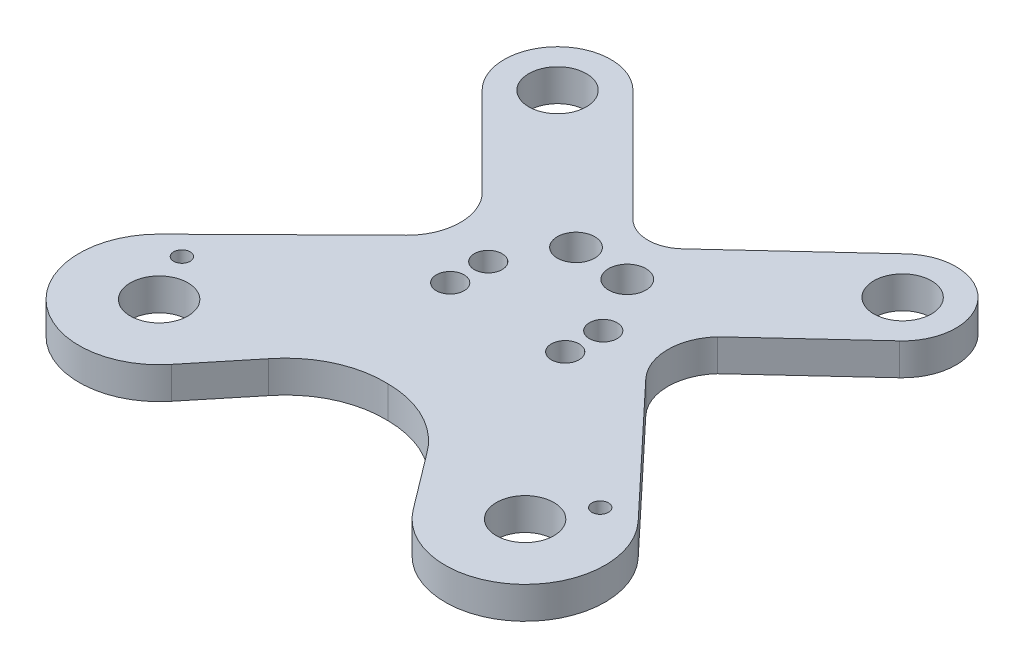
ISO-10303-21;
HEADER;
FILE_DESCRIPTION(('STEP AP214'),'2;1');
FILE_NAME('part.step','',(''),(''),'','','');
FILE_SCHEMA(('AUTOMOTIVE_DESIGN { 1 0 10303 214 1 1 1 1 }'));
ENDSEC;
DATA;
#1=APPLICATION_CONTEXT('core data for automotive mechanical design processes');
#2=APPLICATION_PROTOCOL_DEFINITION('international standard','automotive_design',2000,#1);
#3=PRODUCT_CONTEXT('',#1,'mechanical');
#4=PRODUCT('Part','Part','',(#3));
#5=PRODUCT_RELATED_PRODUCT_CATEGORY('part','',(#4));
#6=PRODUCT_DEFINITION_FORMATION('','',#4);
#7=PRODUCT_DEFINITION_CONTEXT('part definition',#1,'design');
#8=PRODUCT_DEFINITION('design','',#6,#7);
#9=PRODUCT_DEFINITION_SHAPE('','',#8);
#10=(LENGTH_UNIT() NAMED_UNIT(*) SI_UNIT(.MILLI.,.METRE.));
#11=(NAMED_UNIT(*) PLANE_ANGLE_UNIT() SI_UNIT($,.RADIAN.));
#12=(NAMED_UNIT(*) SI_UNIT($,.STERADIAN.) SOLID_ANGLE_UNIT());
#13=UNCERTAINTY_MEASURE_WITH_UNIT(LENGTH_MEASURE(1.E-05),#10,'distance_accuracy_value','');
#14=(GEOMETRIC_REPRESENTATION_CONTEXT(3) GLOBAL_UNCERTAINTY_ASSIGNED_CONTEXT((#13)) GLOBAL_UNIT_ASSIGNED_CONTEXT((#10,
#11,#12)) REPRESENTATION_CONTEXT('',''));
#15=CARTESIAN_POINT('',(0.,0.,0.));
#16=DIRECTION('',(0.,0.,1.));
#17=DIRECTION('',(1.,0.,0.));
#18=AXIS2_PLACEMENT_3D('',#15,#16,#17);
#19=CARTESIAN_POINT('',(-0.0956209056046931,6.00000000000001,-79.3848610675508));
#20=DIRECTION('',(0.,1.,0.));
#21=DIRECTION('',(0.707106781186548,0.,0.707106781186547));
#22=AXIS2_PLACEMENT_3D('',#19,#20,#21);
#23=PLANE('',#22);
#24=CARTESIAN_POINT('',(30.543589466593,6.00000000000001,-126.922027211166));
#25=DIRECTION('',(0.,1.,0.));
#26=DIRECTION('',(0.,0.,1.));
#27=AXIS2_PLACEMENT_3D('',#24,#25,#26);
#28=CIRCLE('',#27,3.50000000001008);
#29=CARTESIAN_POINT('',(30.543589466593,6.00000000000001,-123.422027211156));
#30=VERTEX_POINT('',#29);
#31=EDGE_CURVE('E379',#30,#30,#28,.T.);
#32=ORIENTED_EDGE('',*,*,#31,.F.);
#33=EDGE_LOOP('',(#32));
#34=FACE_BOUND('',#33,.T.);
#35=CARTESIAN_POINT('',(40.5360676139148,6.00000000000001,-126.534237996131));
#36=DIRECTION('',(0.,1.,0.));
#37=DIRECTION('',(0.,0.,1.));
#38=AXIS2_PLACEMENT_3D('',#35,#36,#37);
#39=CIRCLE('',#38,3.50000000001009);
#40=CARTESIAN_POINT('',(40.5360676139148,6.00000000000001,-123.034237996121));
#41=VERTEX_POINT('',#40);
#42=EDGE_CURVE('E389',#41,#41,#39,.T.);
#43=ORIENTED_EDGE('',*,*,#42,.F.);
#44=EDGE_LOOP('',(#43));
#45=FACE_BOUND('',#44,.T.);
#46=CARTESIAN_POINT('',(36.1184906391358,6.00000000000001,-141.638986628402));
#47=DIRECTION('',(0.,1.,0.));
#48=DIRECTION('',(0.,0.,1.));
#49=AXIS2_PLACEMENT_3D('',#46,#47,#48);
#50=CIRCLE('',#49,6.80088429812114);
#51=CARTESIAN_POINT('',(31.2171831110455,6.00000000000001,-136.924200127243));
#52=VERTEX_POINT('',#51);
#53=CARTESIAN_POINT('',(40.8332771402937,6.00000000000001,-136.73767910031));
#54=VERTEX_POINT('',#53);
#55=EDGE_CURVE('E297',#52,#54,#50,.T.);
#56=ORIENTED_EDGE('',*,*,#55,.F.);
#57=DIRECTION('',(-0.707106781186547,0.,-0.707106781186548));
#58=VECTOR('',#57,1.);
#59=CARTESIAN_POINT('',(31.2171831110543,6.00000000000001,-136.924200127251));
#60=LINE('',#59,#58);
#61=CARTESIAN_POINT('',(10.3593187347853,6.00000000000001,-157.78206450352));
#62=VERTEX_POINT('',#61);
#63=EDGE_CURVE('E292',#52,#62,#60,.T.);
#64=ORIENTED_EDGE('',*,*,#63,.T.);
#65=CARTESIAN_POINT('',(3.28825092291982,6.00000000000001,-150.710996691655));
#66=DIRECTION('',(0.,1.,0.));
#67=DIRECTION('',(0.707106781186548,0.,0.707106781186547));
#68=AXIS2_PLACEMENT_3D('',#65,#66,#67);
#69=CIRCLE('',#68,9.99999999999999);
#70=CARTESIAN_POINT('',(-3.78281688894563,6.00000000000001,-143.639928879789));
#71=VERTEX_POINT('',#70);
#72=EDGE_CURVE('E163',#62,#71,#69,.T.);
#73=ORIENTED_EDGE('',*,*,#72,.T.);
#74=DIRECTION('',(0.707106781186547,0.,0.707106781186548));
#75=VECTOR('',#74,1.);
#76=CARTESIAN_POINT('',(-3.78281688894563,6.00000000000003,-143.639928879789));
#77=LINE('',#76,#75);
#78=CARTESIAN_POINT('',(13.3364073304925,6.00000000000002,-126.520704660351));
#79=VERTEX_POINT('',#78);
#80=EDGE_CURVE('E156',#71,#79,#77,.T.);
#81=ORIENTED_EDGE('',*,*,#80,.T.);
#82=CARTESIAN_POINT('',(5.6549620242041,6.00000000000002,-120.11793978832));
#83=DIRECTION('',(0.,-1.,0.));
#84=DIRECTION('',(0.707106781186548,0.,0.707106781186547));
#85=AXIS2_PLACEMENT_3D('',#82,#83,#84);
#86=CIRCLE('',#85,10.0000000000005);
#87=CARTESIAN_POINT('',(12.6692660736421,6.00000000000002,-112.990560276743));
#88=VERTEX_POINT('',#87);
#89=EDGE_CURVE('E161',#79,#88,#86,.T.);
#90=ORIENTED_EDGE('',*,*,#89,.T.);
#91=DIRECTION('',(-0.712737951157667,0.,0.701430404943763));
#92=VECTOR('',#91,1.);
#93=CARTESIAN_POINT('',(-10.7731885851043,6.00000000000001,-89.9200188001007));
#94=LINE('',#93,#92);
#95=CARTESIAN_POINT('',(-10.7731885851043,6.00000000000001,-89.9200188001007));
#96=VERTEX_POINT('',#95);
#97=EDGE_CURVE('E51',#88,#96,#94,.T.);
#98=ORIENTED_EDGE('',*,*,#97,.T.);
#99=CARTESIAN_POINT('',(-0.0956209056046931,6.00000000000001,-79.3848610675508));
#100=DIRECTION('',(0.,1.,0.));
#101=DIRECTION('',(0.707106781186548,0.,0.707106781186547));
#102=AXIS2_PLACEMENT_3D('',#99,#100,#101);
#103=CIRCLE('',#102,15.);
#104=CARTESIAN_POINT('',(11.5870667076271,6.00000000000001,-69.9766300897506));
#105=VERTEX_POINT('',#104);
#106=EDGE_CURVE('E213',#96,#105,#103,.T.);
#107=ORIENTED_EDGE('',*,*,#106,.T.);
#108=DIRECTION('',(0.632796065046581,0.,-0.774318500399908));
#109=VECTOR('',#108,1.);
#110=CARTESIAN_POINT('',(19.7924089135706,6.00000000000002,-80.0170659001511));
#111=LINE('',#110,#109);
#112=CARTESIAN_POINT('',(19.7924089135706,6.00000000000002,-80.0170659001511));
#113=VERTEX_POINT('',#112);
#114=EDGE_CURVE('E119',#105,#113,#111,.T.);
#115=ORIENTED_EDGE('',*,*,#114,.T.);
#116=CARTESIAN_POINT('',(34.407869350894,6.00000000000001,-68.6150192080081));
#117=DIRECTION('',(0.,-1.,0.));
#118=DIRECTION('',(0.707106781186548,0.,0.707106781186547));
#119=AXIS2_PLACEMENT_3D('',#116,#117,#118);
#120=CIRCLE('',#119,18.5369456104498);
#121=CARTESIAN_POINT('',(35.0613956637842,6.00000000000001,-87.1404410904683));
#122=VERTEX_POINT('',#121);
#123=EDGE_CURVE('E255',#113,#122,#120,.T.);
#124=ORIENTED_EDGE('',*,*,#123,.T.);
#125=CARTESIAN_POINT('',(34.9960345228104,6.00000000000001,-68.6036107118404));
#126=DIRECTION('',(0.,-1.,0.));
#127=DIRECTION('',(-0.707106781186548,0.,-0.707106781186547));
#128=AXIS2_PLACEMENT_3D('',#125,#126,#127);
#129=CIRCLE('',#128,18.5369456104498);
#130=CARTESIAN_POINT('',(50.0426604997642,6.00000000000001,-79.4303091594019));
#131=VERTEX_POINT('',#130);
#132=EDGE_CURVE('E275',#122,#131,#129,.T.);
#133=ORIENTED_EDGE('',*,*,#132,.T.);
#134=DIRECTION('',(0.602292848823194,0.,0.798275218365472));
#135=VECTOR('',#134,1.);
#136=CARTESIAN_POINT('',(50.0426604997643,6.00000000000001,-79.4303091594019));
#137=LINE('',#136,#135);
#138=CARTESIAN_POINT('',(57.8524734960304,6.00000000000001,-69.0792312955869));
#139=VERTEX_POINT('',#138);
#140=EDGE_CURVE('E272',#131,#139,#137,.T.);
#141=ORIENTED_EDGE('',*,*,#140,.T.);
#142=CARTESIAN_POINT('',(69.891214614326,6.00000000000002,-78.0273435147458));
#143=DIRECTION('',(0.,1.,0.));
#144=DIRECTION('',(-0.707106781186548,0.,-0.707106781186547));
#145=AXIS2_PLACEMENT_3D('',#142,#143,#144);
#146=CIRCLE('',#145,15.);
#147=CARTESIAN_POINT('',(80.9692928394584,6.00000000000002,-88.1405122979633));
#148=VERTEX_POINT('',#147);
#149=EDGE_CURVE('E274',#139,#148,#146,.T.);
#150=ORIENTED_EDGE('',*,*,#149,.T.);
#151=DIRECTION('',(-0.6850011255575,0.,-0.728542008387271));
#152=VECTOR('',#151,1.);
#153=CARTESIAN_POINT('',(80.9692928394584,6.00000000000002,-88.1405122979633));
#154=LINE('',#153,#152);
#155=CARTESIAN_POINT('',(58.4391219667141,6.00000000000001,-112.102773562248));
#156=VERTEX_POINT('',#155);
#157=EDGE_CURVE('E277',#148,#156,#154,.T.);
#158=ORIENTED_EDGE('',*,*,#157,.T.);
#159=CARTESIAN_POINT('',(65.7245420505871,6.00000000000001,-118.952784817823));
#160=DIRECTION('',(0.,-1.,0.));
#161=DIRECTION('',(-0.707106781186548,0.,-0.707106781186547));
#162=AXIS2_PLACEMENT_3D('',#159,#160,#161);
#163=CIRCLE('',#162,10.0000000000005);
#164=CARTESIAN_POINT('',(58.2971669306716,6.00000000000001,-125.648611789009));
#165=VERTEX_POINT('',#164);
#166=EDGE_CURVE('E283',#156,#165,#163,.T.);
#167=ORIENTED_EDGE('',*,*,#166,.T.);
#168=DIRECTION('',(0.733995744245187,0.,-0.679154067520731));
#169=VECTOR('',#168,1.);
#170=CARTESIAN_POINT('',(76.0673793740617,6.00000000000002,-142.091094127987));
#171=LINE('',#170,#169);
#172=CARTESIAN_POINT('',(76.0673793740617,6.00000000000002,-142.091094127987));
#173=VERTEX_POINT('',#172);
#174=EDGE_CURVE('E285',#165,#173,#171,.T.);
#175=ORIENTED_EDGE('',*,*,#174,.T.);
#176=CARTESIAN_POINT('',(69.2758386988545,6.00000000000002,-149.431051570439));
#177=DIRECTION('',(0.,1.,0.));
#178=DIRECTION('',(-0.707106781186548,0.,-0.707106781186547));
#179=AXIS2_PLACEMENT_3D('',#176,#177,#178);
#180=CIRCLE('',#179,10.);
#181=CARTESIAN_POINT('',(62.4842980236472,6.00000000000001,-156.77100901289));
#182=VERTEX_POINT('',#181);
#183=EDGE_CURVE('E287',#173,#182,#180,.T.);
#184=ORIENTED_EDGE('',*,*,#183,.T.);
#185=DIRECTION('',(-0.733995744245188,0.,0.679154067520731));
#186=VECTOR('',#185,1.);
#187=CARTESIAN_POINT('',(40.8332771403023,6.00000000000001,-136.737679100302));
#188=LINE('',#187,#186);
#189=EDGE_CURVE('E289',#182,#54,#188,.T.);
#190=ORIENTED_EDGE('',*,*,#189,.T.);
#191=EDGE_LOOP('',(#56,#64,#73,#81,#90,#98,#107,#115,#124,#133,#141,#150,#158,#167,#175,#184,#190));
#192=FACE_BOUND('',#191,.T.);
#193=CARTESIAN_POINT('',(-4.92014261445839,6.00000000000003,-88.4801340304254));
#194=DIRECTION('',(0.,-1.,0.));
#195=DIRECTION('',(0.,0.,-1.));
#196=AXIS2_PLACEMENT_3D('',#193,#194,#195);
#197=CIRCLE('',#196,1.54999999946635);
#198=CARTESIAN_POINT('',(-4.92014261445839,6.00000000000003,-90.0301340298918));
#199=VERTEX_POINT('',#198);
#200=EDGE_CURVE('E397',#199,#199,#197,.T.);
#201=ORIENTED_EDGE('',*,*,#200,.T.);
#202=EDGE_LOOP('',(#201));
#203=FACE_BOUND('',#202,.T.);
#204=CARTESIAN_POINT('',(75.0648122654624,6.00000000000003,-86.9286853986485));
#205=DIRECTION('',(0.,-1.,0.));
#206=DIRECTION('',(0.,0.,-1.));
#207=AXIS2_PLACEMENT_3D('',#204,#205,#206);
#208=CIRCLE('',#207,1.54999999946642);
#209=CARTESIAN_POINT('',(75.0648122654624,6.00000000000003,-88.4786853981149));
#210=VERTEX_POINT('',#209);
#211=EDGE_CURVE('E403',#210,#210,#208,.T.);
#212=ORIENTED_EDGE('',*,*,#211,.T.);
#213=EDGE_LOOP('',(#212));
#214=FACE_BOUND('',#213,.T.);
#215=CARTESIAN_POINT('',(46.4864782501451,6.00000000000002,-108.948907371714));
#216=DIRECTION('',(0.,1.,0.));
#217=DIRECTION('',(0.,0.,1.));
#218=AXIS2_PLACEMENT_3D('',#215,#216,#217);
#219=CIRCLE('',#218,2.59999999999984);
#220=CARTESIAN_POINT('',(46.4864782501451,6.00000000000002,-106.348907371714));
#221=VERTEX_POINT('',#220);
#222=EDGE_CURVE('E415',#221,#221,#219,.T.);
#223=ORIENTED_EDGE('',*,*,#222,.F.);
#224=EDGE_LOOP('',(#223));
#225=FACE_BOUND('',#224,.T.);
#226=CARTESIAN_POINT('',(24.4906156581669,6.00000000000002,-109.375555745452));
#227=DIRECTION('',(0.,1.,0.));
#228=DIRECTION('',(0.,0.,1.));
#229=AXIS2_PLACEMENT_3D('',#226,#227,#228);
#230=CIRCLE('',#229,2.59999999999989);
#231=CARTESIAN_POINT('',(24.4906156581669,6.00000000000002,-106.775555745453));
#232=VERTEX_POINT('',#231);
#233=EDGE_CURVE('E427',#232,#232,#230,.T.);
#234=ORIENTED_EDGE('',*,*,#233,.F.);
#235=EDGE_LOOP('',(#234));
#236=FACE_BOUND('',#235,.T.);
#237=CARTESIAN_POINT('',(3.28825092291982,6.00000000000001,-150.710996691655));
#238=DIRECTION('',(0.,1.,0.));
#239=DIRECTION('',(0.707106781186548,0.,0.707106781186547));
#240=AXIS2_PLACEMENT_3D('',#237,#238,#239);
#241=CIRCLE('',#240,5.4);
#242=CARTESIAN_POINT('',(7.10662754132717,6.00000000000001,-146.892620073247));
#243=VERTEX_POINT('',#242);
#244=EDGE_CURVE('E439',#243,#243,#241,.T.);
#245=ORIENTED_EDGE('',*,*,#244,.F.);
#246=EDGE_LOOP('',(#245));
#247=FACE_BOUND('',#246,.T.);
#248=CARTESIAN_POINT('',(-0.0956209056046931,6.00000000000001,-79.3848610675508));
#249=DIRECTION('',(0.,1.,0.));
#250=DIRECTION('',(0.707106781186548,0.,0.707106781186547));
#251=AXIS2_PLACEMENT_3D('',#248,#249,#250);
#252=CIRCLE('',#251,5.40000000000001);
#253=CARTESIAN_POINT('',(3.72275571280267,6.00000000000001,-75.5664844491434));
#254=VERTEX_POINT('',#253);
#255=EDGE_CURVE('E185',#254,#254,#252,.T.);
#256=ORIENTED_EDGE('',*,*,#255,.F.);
#257=EDGE_LOOP('',(#256));
#258=FACE_BOUND('',#257,.T.);
#259=CARTESIAN_POINT('',(69.891214614326,6.00000000000002,-78.0273435147458));
#260=DIRECTION('',(0.,1.,0.));
#261=DIRECTION('',(-0.707106781186548,0.,-0.707106781186547));
#262=AXIS2_PLACEMENT_3D('',#259,#260,#261);
#263=CIRCLE('',#262,5.40000000000001);
#264=CARTESIAN_POINT('',(66.0728379959186,6.00000000000002,-81.8457201331531));
#265=VERTEX_POINT('',#264);
#266=EDGE_CURVE('E445',#265,#265,#263,.T.);
#267=ORIENTED_EDGE('',*,*,#266,.F.);
#268=EDGE_LOOP('',(#267));
#269=FACE_BOUND('',#268,.T.);
#270=CARTESIAN_POINT('',(69.2758386988545,6.00000000000002,-149.431051570439));
#271=DIRECTION('',(0.,1.,0.));
#272=DIRECTION('',(-0.707106781186548,0.,-0.707106781186547));
#273=AXIS2_PLACEMENT_3D('',#270,#271,#272);
#274=CIRCLE('',#273,5.4);
#275=CARTESIAN_POINT('',(65.4574620804471,6.00000000000002,-153.249428188846));
#276=VERTEX_POINT('',#275);
#277=EDGE_CURVE('E433',#276,#276,#274,.T.);
#278=ORIENTED_EDGE('',*,*,#277,.F.);
#279=EDGE_LOOP('',(#278));
#280=FACE_BOUND('',#279,.T.);
#281=CARTESIAN_POINT('',(24.6263674134474,6.00000000000002,-116.374239297446));
#282=DIRECTION('',(0.,1.,0.));
#283=DIRECTION('',(0.,0.,1.));
#284=AXIS2_PLACEMENT_3D('',#281,#282,#283);
#285=CIRCLE('',#284,2.59999999999994);
#286=CARTESIAN_POINT('',(24.6263674134474,6.00000000000002,-113.774239297446));
#287=VERTEX_POINT('',#286);
#288=EDGE_CURVE('E421',#287,#287,#285,.T.);
#289=ORIENTED_EDGE('',*,*,#288,.F.);
#290=EDGE_LOOP('',(#289));
#291=FACE_BOUND('',#290,.T.);
#292=CARTESIAN_POINT('',(46.6222300054256,6.00000000000002,-115.947590923707));
#293=DIRECTION('',(0.,1.,0.));
#294=DIRECTION('',(0.,0.,1.));
#295=AXIS2_PLACEMENT_3D('',#292,#293,#294);
#296=CIRCLE('',#295,2.59999999999991);
#297=CARTESIAN_POINT('',(46.6222300054256,6.00000000000002,-113.347590923707));
#298=VERTEX_POINT('',#297);
#299=EDGE_CURVE('E409',#298,#298,#296,.T.);
#300=ORIENTED_EDGE('',*,*,#299,.F.);
#301=EDGE_LOOP('',(#300));
#302=FACE_BOUND('',#301,.T.);
#303=ADVANCED_FACE('F34',(#34,#45,#192,#203,#214,#225,#236,#247,#258,#269,#280,#291,#302),#23,.T.);
#304=CARTESIAN_POINT('',(-0.0956209056046931,0.,-79.3848610675508));
#305=DIRECTION('',(0.,1.,0.));
#306=DIRECTION('',(0.707106781186548,0.,0.707106781186547));
#307=AXIS2_PLACEMENT_3D('',#304,#305,#306);
#308=PLANE('',#307);
#309=CARTESIAN_POINT('',(30.543589466593,0.,-126.922027211166));
#310=DIRECTION('',(0.,-1.,0.));
#311=DIRECTION('',(0.,0.,-1.));
#312=AXIS2_PLACEMENT_3D('',#309,#310,#311);
#313=CIRCLE('',#312,3.50000000001008);
#314=CARTESIAN_POINT('',(30.543589466593,0.,-130.422027211176));
#315=VERTEX_POINT('',#314);
#316=EDGE_CURVE('E382',#315,#315,#313,.T.);
#317=ORIENTED_EDGE('',*,*,#316,.F.);
#318=EDGE_LOOP('',(#317));
#319=FACE_BOUND('',#318,.T.);
#320=CARTESIAN_POINT('',(40.5360676139148,0.,-126.534237996131));
#321=DIRECTION('',(0.,-1.,0.));
#322=DIRECTION('',(0.,0.,-1.));
#323=AXIS2_PLACEMENT_3D('',#320,#321,#322);
#324=CIRCLE('',#323,3.50000000001009);
#325=CARTESIAN_POINT('',(40.5360676139148,0.,-130.034237996141));
#326=VERTEX_POINT('',#325);
#327=EDGE_CURVE('E384',#326,#326,#324,.T.);
#328=ORIENTED_EDGE('',*,*,#327,.F.);
#329=EDGE_LOOP('',(#328));
#330=FACE_BOUND('',#329,.T.);
#331=CARTESIAN_POINT('',(-4.92014261445839,0.,-88.4801340304254));
#332=DIRECTION('',(0.,-1.,0.));
#333=DIRECTION('',(0.,0.,-1.));
#334=AXIS2_PLACEMENT_3D('',#331,#332,#333);
#335=CIRCLE('',#334,1.54999999946635);
#336=CARTESIAN_POINT('',(-4.92014261445839,0.,-90.0301340298918));
#337=VERTEX_POINT('',#336);
#338=EDGE_CURVE('E395',#337,#337,#335,.T.);
#339=ORIENTED_EDGE('',*,*,#338,.F.);
#340=EDGE_LOOP('',(#339));
#341=FACE_BOUND('',#340,.T.);
#342=CARTESIAN_POINT('',(75.0648122654624,0.,-86.9286853986485));
#343=DIRECTION('',(0.,-1.,0.));
#344=DIRECTION('',(0.,0.,-1.));
#345=AXIS2_PLACEMENT_3D('',#342,#343,#344);
#346=CIRCLE('',#345,1.54999999946642);
#347=CARTESIAN_POINT('',(75.0648122654624,0.,-88.4786853981149));
#348=VERTEX_POINT('',#347);
#349=EDGE_CURVE('E400',#348,#348,#346,.T.);
#350=ORIENTED_EDGE('',*,*,#349,.F.);
#351=EDGE_LOOP('',(#350));
#352=FACE_BOUND('',#351,.T.);
#353=CARTESIAN_POINT('',(46.4864782501451,0.,-108.948907371714));
#354=DIRECTION('',(0.,1.,0.));
#355=DIRECTION('',(0.,0.,1.));
#356=AXIS2_PLACEMENT_3D('',#353,#354,#355);
#357=CIRCLE('',#356,2.59999999999984);
#358=CARTESIAN_POINT('',(46.4864782501451,0.,-106.348907371714));
#359=VERTEX_POINT('',#358);
#360=EDGE_CURVE('E412',#359,#359,#357,.T.);
#361=ORIENTED_EDGE('',*,*,#360,.T.);
#362=EDGE_LOOP('',(#361));
#363=FACE_BOUND('',#362,.T.);
#364=CARTESIAN_POINT('',(24.4906156581669,0.,-109.375555745452));
#365=DIRECTION('',(0.,1.,0.));
#366=DIRECTION('',(0.,0.,1.));
#367=AXIS2_PLACEMENT_3D('',#364,#365,#366);
#368=CIRCLE('',#367,2.59999999999989);
#369=CARTESIAN_POINT('',(24.4906156581669,0.,-106.775555745453));
#370=VERTEX_POINT('',#369);
#371=EDGE_CURVE('E424',#370,#370,#368,.T.);
#372=ORIENTED_EDGE('',*,*,#371,.T.);
#373=EDGE_LOOP('',(#372));
#374=FACE_BOUND('',#373,.T.);
#375=CARTESIAN_POINT('',(3.28825092291982,0.,-150.710996691655));
#376=DIRECTION('',(0.,1.,0.));
#377=DIRECTION('',(0.707106781186548,0.,0.707106781186547));
#378=AXIS2_PLACEMENT_3D('',#375,#376,#377);
#379=CIRCLE('',#378,5.4);
#380=CARTESIAN_POINT('',(7.10662754132717,0.,-146.892620073247));
#381=VERTEX_POINT('',#380);
#382=EDGE_CURVE('E436',#381,#381,#379,.T.);
#383=ORIENTED_EDGE('',*,*,#382,.T.);
#384=EDGE_LOOP('',(#383));
#385=FACE_BOUND('',#384,.T.);
#386=CARTESIAN_POINT('',(-0.0956209056046931,0.,-79.3848610675508));
#387=DIRECTION('',(0.,1.,0.));
#388=DIRECTION('',(0.707106781186548,0.,0.707106781186547));
#389=AXIS2_PLACEMENT_3D('',#386,#387,#388);
#390=CIRCLE('',#389,5.40000000000001);
#391=CARTESIAN_POINT('',(3.72275571280267,0.,-75.5664844491434));
#392=VERTEX_POINT('',#391);
#393=EDGE_CURVE('E448',#392,#392,#390,.T.);
#394=ORIENTED_EDGE('',*,*,#393,.T.);
#395=EDGE_LOOP('',(#394));
#396=FACE_BOUND('',#395,.T.);
#397=DIRECTION('',(-0.707106781186547,0.,-0.707106781186548));
#398=VECTOR('',#397,1.);
#399=CARTESIAN_POINT('',(31.2171831110543,0.,-136.924200127251));
#400=LINE('',#399,#398);
#401=CARTESIAN_POINT('',(31.2171831110543,0.,-136.924200127251));
#402=VERTEX_POINT('',#401);
#403=CARTESIAN_POINT('',(10.3593187347853,0.,-157.78206450352));
#404=VERTEX_POINT('',#403);
#405=EDGE_CURVE('E206',#402,#404,#400,.T.);
#406=ORIENTED_EDGE('',*,*,#405,.F.);
#407=CARTESIAN_POINT('',(36.1184906391358,0.,-141.638986628402));
#408=DIRECTION('',(0.,1.,0.));
#409=DIRECTION('',(0.,0.,1.));
#410=AXIS2_PLACEMENT_3D('',#407,#408,#409);
#411=CIRCLE('',#410,6.80088429812114);
#412=CARTESIAN_POINT('',(40.8332771402937,0.,-136.73767910031));
#413=VERTEX_POINT('',#412);
#414=EDGE_CURVE('E392',#402,#413,#411,.T.);
#415=ORIENTED_EDGE('',*,*,#414,.T.);
#416=DIRECTION('',(-0.733995744245188,0.,0.679154067520731));
#417=VECTOR('',#416,1.);
#418=CARTESIAN_POINT('',(40.8332771403023,0.,-136.737679100302));
#419=LINE('',#418,#417);
#420=CARTESIAN_POINT('',(62.4842980236472,0.,-156.77100901289));
#421=VERTEX_POINT('',#420);
#422=EDGE_CURVE('E203',#421,#413,#419,.T.);
#423=ORIENTED_EDGE('',*,*,#422,.F.);
#424=CARTESIAN_POINT('',(69.2758386988545,0.,-149.431051570439));
#425=DIRECTION('',(0.,1.,0.));
#426=DIRECTION('',(-0.707106781186548,0.,-0.707106781186547));
#427=AXIS2_PLACEMENT_3D('',#424,#425,#426);
#428=CIRCLE('',#427,10.);
#429=CARTESIAN_POINT('',(76.0673793740617,0.,-142.091094127987));
#430=VERTEX_POINT('',#429);
#431=EDGE_CURVE('E201',#430,#421,#428,.T.);
#432=ORIENTED_EDGE('',*,*,#431,.F.);
#433=DIRECTION('',(0.733995744245187,0.,-0.679154067520731));
#434=VECTOR('',#433,1.);
#435=CARTESIAN_POINT('',(76.0673793740617,0.,-142.091094127987));
#436=LINE('',#435,#434);
#437=CARTESIAN_POINT('',(58.2971669306716,0.,-125.648611789009));
#438=VERTEX_POINT('',#437);
#439=EDGE_CURVE('E199',#438,#430,#436,.T.);
#440=ORIENTED_EDGE('',*,*,#439,.F.);
#441=CARTESIAN_POINT('',(65.7245420505871,0.,-118.952784817823));
#442=DIRECTION('',(0.,-1.,0.));
#443=DIRECTION('',(-0.707106781186548,0.,-0.707106781186547));
#444=AXIS2_PLACEMENT_3D('',#441,#442,#443);
#445=CIRCLE('',#444,10.0000000000005);
#446=CARTESIAN_POINT('',(58.4391219667141,0.,-112.102773562248));
#447=VERTEX_POINT('',#446);
#448=EDGE_CURVE('E197',#447,#438,#445,.T.);
#449=ORIENTED_EDGE('',*,*,#448,.F.);
#450=DIRECTION('',(-0.6850011255575,0.,-0.728542008387271));
#451=VECTOR('',#450,1.);
#452=CARTESIAN_POINT('',(80.9692928394584,0.,-88.1405122979633));
#453=LINE('',#452,#451);
#454=CARTESIAN_POINT('',(80.9692928394584,0.,-88.1405122979633));
#455=VERTEX_POINT('',#454);
#456=EDGE_CURVE('E195',#455,#447,#453,.T.);
#457=ORIENTED_EDGE('',*,*,#456,.F.);
#458=CARTESIAN_POINT('',(69.891214614326,0.,-78.0273435147458));
#459=DIRECTION('',(0.,1.,0.));
#460=DIRECTION('',(-0.707106781186548,0.,-0.707106781186547));
#461=AXIS2_PLACEMENT_3D('',#458,#459,#460);
#462=CIRCLE('',#461,15.);
#463=CARTESIAN_POINT('',(57.8524734960304,0.,-69.0792312955869));
#464=VERTEX_POINT('',#463);
#465=EDGE_CURVE('E193',#464,#455,#462,.T.);
#466=ORIENTED_EDGE('',*,*,#465,.F.);
#467=DIRECTION('',(0.602292848823194,0.,0.798275218365472));
#468=VECTOR('',#467,1.);
#469=CARTESIAN_POINT('',(50.0426604997643,0.,-79.4303091594019));
#470=LINE('',#469,#468);
#471=CARTESIAN_POINT('',(50.0426604997643,0.,-79.4303091594019));
#472=VERTEX_POINT('',#471);
#473=EDGE_CURVE('E191',#472,#464,#470,.T.);
#474=ORIENTED_EDGE('',*,*,#473,.F.);
#475=CARTESIAN_POINT('',(34.9960345228104,0.,-68.6036107118404));
#476=DIRECTION('',(0.,-1.,0.));
#477=DIRECTION('',(-0.707106781186548,0.,-0.707106781186547));
#478=AXIS2_PLACEMENT_3D('',#475,#476,#477);
#479=CIRCLE('',#478,18.5369456104498);
#480=CARTESIAN_POINT('',(35.0613956637842,0.,-87.1404410904683));
#481=VERTEX_POINT('',#480);
#482=EDGE_CURVE('E189',#481,#472,#479,.T.);
#483=ORIENTED_EDGE('',*,*,#482,.F.);
#484=CARTESIAN_POINT('',(34.407869350894,0.,-68.6150192080081));
#485=DIRECTION('',(0.,-1.,0.));
#486=DIRECTION('',(0.707106781186548,0.,0.707106781186547));
#487=AXIS2_PLACEMENT_3D('',#484,#485,#486);
#488=CIRCLE('',#487,18.5369456104498);
#489=CARTESIAN_POINT('',(19.7924089135706,0.,-80.0170659001511));
#490=VERTEX_POINT('',#489);
#491=EDGE_CURVE('E187',#490,#481,#488,.T.);
#492=ORIENTED_EDGE('',*,*,#491,.F.);
#493=DIRECTION('',(0.632796065046581,0.,-0.774318500399908));
#494=VECTOR('',#493,1.);
#495=CARTESIAN_POINT('',(19.7924089135706,0.,-80.0170659001511));
#496=LINE('',#495,#494);
#497=CARTESIAN_POINT('',(11.5870667076271,0.,-69.9766300897506));
#498=VERTEX_POINT('',#497);
#499=EDGE_CURVE('E184',#498,#490,#496,.T.);
#500=ORIENTED_EDGE('',*,*,#499,.F.);
#501=CARTESIAN_POINT('',(-0.0956209056046931,0.,-79.3848610675508));
#502=DIRECTION('',(0.,1.,0.));
#503=DIRECTION('',(0.707106781186548,0.,0.707106781186547));
#504=AXIS2_PLACEMENT_3D('',#501,#502,#503);
#505=CIRCLE('',#504,15.);
#506=CARTESIAN_POINT('',(-10.7731885851043,0.,-89.9200188001007));
#507=VERTEX_POINT('',#506);
#508=EDGE_CURVE('E181',#507,#498,#505,.T.);
#509=ORIENTED_EDGE('',*,*,#508,.F.);
#510=DIRECTION('',(-0.712737951157667,0.,0.701430404943763));
#511=VECTOR('',#510,1.);
#512=CARTESIAN_POINT('',(-10.7731885851043,0.,-89.9200188001007));
#513=LINE('',#512,#511);
#514=CARTESIAN_POINT('',(12.6692660736421,0.,-112.990560276743));
#515=VERTEX_POINT('',#514);
#516=EDGE_CURVE('E111',#515,#507,#513,.T.);
#517=ORIENTED_EDGE('',*,*,#516,.F.);
#518=CARTESIAN_POINT('',(5.6549620242041,0.,-120.11793978832));
#519=DIRECTION('',(0.,-1.,0.));
#520=DIRECTION('',(0.707106781186548,0.,0.707106781186547));
#521=AXIS2_PLACEMENT_3D('',#518,#519,#520);
#522=CIRCLE('',#521,10.0000000000005);
#523=CARTESIAN_POINT('',(13.3364073304925,0.,-126.520704660351));
#524=VERTEX_POINT('',#523);
#525=EDGE_CURVE('E105',#524,#515,#522,.T.);
#526=ORIENTED_EDGE('',*,*,#525,.F.);
#527=DIRECTION('',(0.707106781186547,0.,0.707106781186548));
#528=VECTOR('',#527,1.);
#529=CARTESIAN_POINT('',(-3.78281688894563,0.,-143.639928879789));
#530=LINE('',#529,#528);
#531=CARTESIAN_POINT('',(-3.78281688894563,0.,-143.639928879789));
#532=VERTEX_POINT('',#531);
#533=EDGE_CURVE('E171',#532,#524,#530,.T.);
#534=ORIENTED_EDGE('',*,*,#533,.F.);
#535=CARTESIAN_POINT('',(3.28825092291982,0.,-150.710996691655));
#536=DIRECTION('',(0.,1.,0.));
#537=DIRECTION('',(0.707106781186548,0.,0.707106781186547));
#538=AXIS2_PLACEMENT_3D('',#535,#536,#537);
#539=CIRCLE('',#538,9.99999999999999);
#540=EDGE_CURVE('E208',#404,#532,#539,.T.);
#541=ORIENTED_EDGE('',*,*,#540,.F.);
#542=EDGE_LOOP('',(#406,#415,#423,#432,#440,#449,#457,#466,#474,#483,#492,#500,#509,#517,#526,
#534,#541));
#543=FACE_BOUND('',#542,.T.);
#544=CARTESIAN_POINT('',(69.891214614326,0.,-78.0273435147458));
#545=DIRECTION('',(0.,1.,0.));
#546=DIRECTION('',(-0.707106781186548,0.,-0.707106781186547));
#547=AXIS2_PLACEMENT_3D('',#544,#545,#546);
#548=CIRCLE('',#547,5.40000000000001);
#549=CARTESIAN_POINT('',(66.0728379959186,0.,-81.8457201331531));
#550=VERTEX_POINT('',#549);
#551=EDGE_CURVE('E442',#550,#550,#548,.T.);
#552=ORIENTED_EDGE('',*,*,#551,.T.);
#553=EDGE_LOOP('',(#552));
#554=FACE_BOUND('',#553,.T.);
#555=CARTESIAN_POINT('',(69.2758386988545,0.,-149.431051570439));
#556=DIRECTION('',(0.,1.,0.));
#557=DIRECTION('',(-0.707106781186548,0.,-0.707106781186547));
#558=AXIS2_PLACEMENT_3D('',#555,#556,#557);
#559=CIRCLE('',#558,5.4);
#560=CARTESIAN_POINT('',(65.4574620804471,0.,-153.249428188846));
#561=VERTEX_POINT('',#560);
#562=EDGE_CURVE('E430',#561,#561,#559,.T.);
#563=ORIENTED_EDGE('',*,*,#562,.T.);
#564=EDGE_LOOP('',(#563));
#565=FACE_BOUND('',#564,.T.);
#566=CARTESIAN_POINT('',(24.6263674134474,0.,-116.374239297446));
#567=DIRECTION('',(0.,1.,0.));
#568=DIRECTION('',(0.,0.,1.));
#569=AXIS2_PLACEMENT_3D('',#566,#567,#568);
#570=CIRCLE('',#569,2.59999999999994);
#571=CARTESIAN_POINT('',(24.6263674134474,0.,-113.774239297446));
#572=VERTEX_POINT('',#571);
#573=EDGE_CURVE('E418',#572,#572,#570,.T.);
#574=ORIENTED_EDGE('',*,*,#573,.T.);
#575=EDGE_LOOP('',(#574));
#576=FACE_BOUND('',#575,.T.);
#577=CARTESIAN_POINT('',(46.6222300054256,0.,-115.947590923707));
#578=DIRECTION('',(0.,1.,0.));
#579=DIRECTION('',(0.,0.,1.));
#580=AXIS2_PLACEMENT_3D('',#577,#578,#579);
#581=CIRCLE('',#580,2.59999999999991);
#582=CARTESIAN_POINT('',(46.6222300054256,0.,-113.347590923707));
#583=VERTEX_POINT('',#582);
#584=EDGE_CURVE('E406',#583,#583,#581,.T.);
#585=ORIENTED_EDGE('',*,*,#584,.T.);
#586=EDGE_LOOP('',(#585));
#587=FACE_BOUND('',#586,.T.);
#588=ADVANCED_FACE('F259',(#319,#330,#341,#352,#363,#374,#385,#396,#543,#554,#565,#576,#587),
#308,.F.);
#589=CARTESIAN_POINT('',(-0.0956209056046931,6.00000000000001,-79.3848610675508));
#590=DIRECTION('',(0.,-1.,0.));
#591=DIRECTION('',(-0.707106781186548,0.,-0.707106781186547));
#592=AXIS2_PLACEMENT_3D('',#589,#590,#591);
#593=CYLINDRICAL_SURFACE('',#592,15.);
#594=ORIENTED_EDGE('',*,*,#508,.T.);
#595=DIRECTION('',(0.,-1.,0.));
#596=VECTOR('',#595,1.);
#597=CARTESIAN_POINT('',(11.5870667076271,6.00000000000001,-69.9766300897506));
#598=LINE('',#597,#596);
#599=EDGE_CURVE('E11',#105,#498,#598,.T.);
#600=ORIENTED_EDGE('',*,*,#599,.F.);
#601=ORIENTED_EDGE('',*,*,#106,.F.);
#602=DIRECTION('',(0.,-1.,0.));
#603=VECTOR('',#602,1.);
#604=CARTESIAN_POINT('',(-10.7731885851043,6.00000000000001,-89.9200188001007));
#605=LINE('',#604,#603);
#606=EDGE_CURVE('E177',#96,#507,#605,.T.);
#607=ORIENTED_EDGE('',*,*,#606,.T.);
#608=EDGE_LOOP('',(#594,#600,#601,#607));
#609=FACE_BOUND('',#608,.T.);
#610=ADVANCED_FACE('F36',(#609),#593,.T.);
#611=CARTESIAN_POINT('',(19.7924089135706,6.00000000000002,-80.0170659001511));
#612=DIRECTION('',(-0.774318500399908,0.,-0.632796065046581));
#613=DIRECTION('',(0.,1.,0.));
#614=AXIS2_PLACEMENT_3D('',#611,#612,#613);
#615=PLANE('',#614);
#616=ORIENTED_EDGE('',*,*,#499,.T.);
#617=DIRECTION('',(0.,-1.,0.));
#618=VECTOR('',#617,1.);
#619=CARTESIAN_POINT('',(19.7924089135706,6.00000000000002,-80.0170659001511));
#620=LINE('',#619,#618);
#621=EDGE_CURVE('E43',#113,#490,#620,.T.);
#622=ORIENTED_EDGE('',*,*,#621,.F.);
#623=ORIENTED_EDGE('',*,*,#114,.F.);
#624=ORIENTED_EDGE('',*,*,#599,.T.);
#625=EDGE_LOOP('',(#616,#622,#623,#624));
#626=FACE_BOUND('',#625,.T.);
#627=ADVANCED_FACE('F547',(#626),#615,.F.);
#628=CARTESIAN_POINT('',(34.407869350894,6.00000000000001,-68.6150192080081));
#629=DIRECTION('',(0.,-1.,0.));
#630=DIRECTION('',(-0.707106781186548,0.,-0.707106781186547));
#631=AXIS2_PLACEMENT_3D('',#628,#629,#630);
#632=CYLINDRICAL_SURFACE('',#631,18.5369456104498);
#633=ORIENTED_EDGE('',*,*,#491,.T.);
#634=DIRECTION('',(0.,-1.,0.));
#635=VECTOR('',#634,1.);
#636=CARTESIAN_POINT('',(35.0613956637842,6.00000000000001,-87.1404410904683));
#637=LINE('',#636,#635);
#638=EDGE_CURVE('E247',#122,#481,#637,.T.);
#639=ORIENTED_EDGE('',*,*,#638,.F.);
#640=ORIENTED_EDGE('',*,*,#123,.F.);
#641=ORIENTED_EDGE('',*,*,#621,.T.);
#642=EDGE_LOOP('',(#633,#639,#640,#641));
#643=FACE_BOUND('',#642,.T.);
#644=ADVANCED_FACE('F253',(#643),#632,.F.);
#645=CARTESIAN_POINT('',(34.9960345228104,6.00000000000001,-68.6036107118404));
#646=DIRECTION('',(0.,-1.,0.));
#647=DIRECTION('',(-0.707106781186548,0.,-0.707106781186547));
#648=AXIS2_PLACEMENT_3D('',#645,#646,#647);
#649=CYLINDRICAL_SURFACE('',#648,18.5369456104498);
#650=ORIENTED_EDGE('',*,*,#482,.T.);
#651=DIRECTION('',(0.,-1.,0.));
#652=VECTOR('',#651,1.);
#653=CARTESIAN_POINT('',(50.0426604997642,6.00000000000001,-79.4303091594019));
#654=LINE('',#653,#652);
#655=EDGE_CURVE('E244',#131,#472,#654,.T.);
#656=ORIENTED_EDGE('',*,*,#655,.F.);
#657=ORIENTED_EDGE('',*,*,#132,.F.);
#658=ORIENTED_EDGE('',*,*,#638,.T.);
#659=EDGE_LOOP('',(#650,#656,#657,#658));
#660=FACE_BOUND('',#659,.T.);
#661=ADVANCED_FACE('F266',(#660),#649,.F.);
#662=CARTESIAN_POINT('',(50.0426604997643,6.00000000000001,-79.4303091594019));
#663=DIRECTION('',(0.798275218365471,0.,-0.602292848823194));
#664=DIRECTION('',(-0.427944935645515,0.703670601249489,-0.567195572084743));
#665=AXIS2_PLACEMENT_3D('',#662,#663,#664);
#666=PLANE('',#665);
#667=ORIENTED_EDGE('',*,*,#473,.T.);
#668=DIRECTION('',(0.,-1.,0.));
#669=VECTOR('',#668,1.);
#670=CARTESIAN_POINT('',(57.8524734960304,6.00000000000001,-69.0792312955869));
#671=LINE('',#670,#669);
#672=EDGE_CURVE('E241',#139,#464,#671,.T.);
#673=ORIENTED_EDGE('',*,*,#672,.F.);
#674=ORIENTED_EDGE('',*,*,#140,.F.);
#675=ORIENTED_EDGE('',*,*,#655,.T.);
#676=EDGE_LOOP('',(#667,#673,#674,#675));
#677=FACE_BOUND('',#676,.T.);
#678=ADVANCED_FACE('F270',(#677),#666,.F.);
#679=CARTESIAN_POINT('',(69.891214614326,6.00000000000002,-78.0273435147458));
#680=DIRECTION('',(0.,-1.,0.));
#681=DIRECTION('',(-0.707106781186548,0.,-0.707106781186547));
#682=AXIS2_PLACEMENT_3D('',#679,#680,#681);
#683=CYLINDRICAL_SURFACE('',#682,15.);
#684=ORIENTED_EDGE('',*,*,#465,.T.);
#685=DIRECTION('',(0.,-1.,0.));
#686=VECTOR('',#685,1.);
#687=CARTESIAN_POINT('',(80.9692928394584,6.00000000000002,-88.1405122979633));
#688=LINE('',#687,#686);
#689=EDGE_CURVE('E238',#148,#455,#688,.T.);
#690=ORIENTED_EDGE('',*,*,#689,.F.);
#691=ORIENTED_EDGE('',*,*,#149,.F.);
#692=ORIENTED_EDGE('',*,*,#672,.T.);
#693=EDGE_LOOP('',(#684,#690,#691,#692));
#694=FACE_BOUND('',#693,.T.);
#695=ADVANCED_FACE('F533',(#694),#683,.T.);
#696=CARTESIAN_POINT('',(80.9692928394584,6.00000000000002,-88.1405122979633));
#697=DIRECTION('',(-0.728542008387271,0.,0.6850011255575));
#698=DIRECTION('',(0.484483765662861,-0.706939114472906,0.51527911779675));
#699=AXIS2_PLACEMENT_3D('',#696,#697,#698);
#700=PLANE('',#699);
#701=ORIENTED_EDGE('',*,*,#456,.T.);
#702=DIRECTION('',(0.,-1.,0.));
#703=VECTOR('',#702,1.);
#704=CARTESIAN_POINT('',(58.4391219667141,6.00000000000001,-112.102773562248));
#705=LINE('',#704,#703);
#706=EDGE_CURVE('E235',#156,#447,#705,.T.);
#707=ORIENTED_EDGE('',*,*,#706,.F.);
#708=ORIENTED_EDGE('',*,*,#157,.F.);
#709=ORIENTED_EDGE('',*,*,#689,.T.);
#710=EDGE_LOOP('',(#701,#707,#708,#709));
#711=FACE_BOUND('',#710,.T.);
#712=ADVANCED_FACE('F529',(#711),#700,.F.);
#713=CARTESIAN_POINT('',(65.7245420505871,6.00000000000001,-118.952784817823));
#714=DIRECTION('',(0.,-1.,0.));
#715=DIRECTION('',(-0.707106781186548,0.,-0.707106781186547));
#716=AXIS2_PLACEMENT_3D('',#713,#714,#715);
#717=CYLINDRICAL_SURFACE('',#716,10.0000000000005);
#718=ORIENTED_EDGE('',*,*,#448,.T.);
#719=DIRECTION('',(0.,-1.,0.));
#720=VECTOR('',#719,1.);
#721=CARTESIAN_POINT('',(58.2971669306716,6.00000000000001,-125.648611789009));
#722=LINE('',#721,#720);
#723=EDGE_CURVE('E232',#165,#438,#722,.T.);
#724=ORIENTED_EDGE('',*,*,#723,.F.);
#725=ORIENTED_EDGE('',*,*,#166,.F.);
#726=ORIENTED_EDGE('',*,*,#706,.T.);
#727=EDGE_LOOP('',(#718,#724,#725,#726));
#728=FACE_BOUND('',#727,.T.);
#729=ADVANCED_FACE('F525',(#728),#717,.F.);
#730=CARTESIAN_POINT('',(76.0673793740617,6.00000000000002,-142.091094127987));
#731=DIRECTION('',(-0.679154067520731,0.,-0.733995744245187));
#732=DIRECTION('',(0.,1.,0.));
#733=AXIS2_PLACEMENT_3D('',#730,#731,#732);
#734=PLANE('',#733);
#735=ORIENTED_EDGE('',*,*,#439,.T.);
#736=DIRECTION('',(0.,-1.,0.));
#737=VECTOR('',#736,1.);
#738=CARTESIAN_POINT('',(76.0673793740617,6.00000000000002,-142.091094127987));
#739=LINE('',#738,#737);
#740=EDGE_CURVE('E229',#173,#430,#739,.T.);
#741=ORIENTED_EDGE('',*,*,#740,.F.);
#742=ORIENTED_EDGE('',*,*,#174,.F.);
#743=ORIENTED_EDGE('',*,*,#723,.T.);
#744=EDGE_LOOP('',(#735,#741,#742,#743));
#745=FACE_BOUND('',#744,.T.);
#746=ADVANCED_FACE('F521',(#745),#734,.F.);
#747=CARTESIAN_POINT('',(69.2758386988545,6.00000000000002,-149.431051570439));
#748=DIRECTION('',(0.,-1.,0.));
#749=DIRECTION('',(-0.707106781186548,0.,-0.707106781186547));
#750=AXIS2_PLACEMENT_3D('',#747,#748,#749);
#751=CYLINDRICAL_SURFACE('',#750,10.);
#752=ORIENTED_EDGE('',*,*,#431,.T.);
#753=DIRECTION('',(0.,-1.,0.));
#754=VECTOR('',#753,1.);
#755=CARTESIAN_POINT('',(62.4842980236472,6.00000000000001,-156.77100901289));
#756=LINE('',#755,#754);
#757=EDGE_CURVE('E226',#182,#421,#756,.T.);
#758=ORIENTED_EDGE('',*,*,#757,.F.);
#759=ORIENTED_EDGE('',*,*,#183,.F.);
#760=ORIENTED_EDGE('',*,*,#740,.T.);
#761=EDGE_LOOP('',(#752,#758,#759,#760));
#762=FACE_BOUND('',#761,.T.);
#763=ADVANCED_FACE('F517',(#762),#751,.T.);
#764=CARTESIAN_POINT('',(40.8332771403023,6.00000000000001,-136.737679100302));
#765=DIRECTION('',(0.679154067520731,0.,0.733995744245187));
#766=DIRECTION('',(0.,-1.,0.));
#767=AXIS2_PLACEMENT_3D('',#764,#765,#766);
#768=PLANE('',#767);
#769=ORIENTED_EDGE('',*,*,#422,.T.);
#770=DIRECTION('',(0.,-1.,0.));
#771=VECTOR('',#770,1.);
#772=CARTESIAN_POINT('',(40.8332771403023,6.00000000000001,-136.737679100302));
#773=LINE('',#772,#771);
#774=EDGE_CURVE('E223',#54,#413,#773,.T.);
#775=ORIENTED_EDGE('',*,*,#774,.F.);
#776=ORIENTED_EDGE('',*,*,#189,.F.);
#777=ORIENTED_EDGE('',*,*,#757,.T.);
#778=EDGE_LOOP('',(#769,#775,#776,#777));
#779=FACE_BOUND('',#778,.T.);
#780=ADVANCED_FACE('F510',(#779),#768,.F.);
#781=CARTESIAN_POINT('',(31.2171831110543,6.00000000000001,-136.924200127251));
#782=DIRECTION('',(-0.707106781186548,0.,0.707106781186547));
#783=DIRECTION('',(0.5,-0.707106781186547,0.5));
#784=AXIS2_PLACEMENT_3D('',#781,#782,#783);
#785=PLANE('',#784);
#786=ORIENTED_EDGE('',*,*,#405,.T.);
#787=DIRECTION('',(0.,-1.,0.));
#788=VECTOR('',#787,1.);
#789=CARTESIAN_POINT('',(10.3593187347853,6.00000000000001,-157.78206450352));
#790=LINE('',#789,#788);
#791=EDGE_CURVE('E217',#62,#404,#790,.T.);
#792=ORIENTED_EDGE('',*,*,#791,.F.);
#793=ORIENTED_EDGE('',*,*,#63,.F.);
#794=DIRECTION('',(0.,-1.,0.));
#795=VECTOR('',#794,1.);
#796=CARTESIAN_POINT('',(31.2171831110543,6.00000000000002,-136.924200127251));
#797=LINE('',#796,#795);
#798=EDGE_CURVE('E220',#52,#402,#797,.T.);
#799=ORIENTED_EDGE('',*,*,#798,.T.);
#800=EDGE_LOOP('',(#786,#792,#793,#799));
#801=FACE_BOUND('',#800,.T.);
#802=ADVANCED_FACE('F299',(#801),#785,.F.);
#803=CARTESIAN_POINT('',(3.28825092291982,6.00000000000001,-150.710996691655));
#804=DIRECTION('',(0.,-1.,0.));
#805=DIRECTION('',(-0.707106781186548,0.,-0.707106781186547));
#806=AXIS2_PLACEMENT_3D('',#803,#804,#805);
#807=CYLINDRICAL_SURFACE('',#806,9.99999999999999);
#808=ORIENTED_EDGE('',*,*,#540,.T.);
#809=DIRECTION('',(0.,-1.,0.));
#810=VECTOR('',#809,1.);
#811=CARTESIAN_POINT('',(-3.78281688894563,6.00000000000001,-143.639928879789));
#812=LINE('',#811,#810);
#813=EDGE_CURVE('E172',#71,#532,#812,.T.);
#814=ORIENTED_EDGE('',*,*,#813,.F.);
#815=ORIENTED_EDGE('',*,*,#72,.F.);
#816=ORIENTED_EDGE('',*,*,#791,.T.);
#817=EDGE_LOOP('',(#808,#814,#815,#816));
#818=FACE_BOUND('',#817,.T.);
#819=ADVANCED_FACE('F302',(#818),#807,.T.);
#820=CARTESIAN_POINT('',(-3.78281688894563,6.00000000000003,-143.639928879789));
#821=DIRECTION('',(0.707106781186548,0.,-0.707106781186547));
#822=DIRECTION('',(-0.5,0.707106781186547,-0.500000000000001));
#823=AXIS2_PLACEMENT_3D('',#820,#821,#822);
#824=PLANE('',#823);
#825=ORIENTED_EDGE('',*,*,#533,.T.);
#826=DIRECTION('',(0.,-1.,0.));
#827=VECTOR('',#826,1.);
#828=CARTESIAN_POINT('',(13.3364073304925,6.00000000000002,-126.520704660351));
#829=LINE('',#828,#827);
#830=EDGE_CURVE('E168',#79,#524,#829,.T.);
#831=ORIENTED_EDGE('',*,*,#830,.F.);
#832=ORIENTED_EDGE('',*,*,#80,.F.);
#833=ORIENTED_EDGE('',*,*,#813,.T.);
#834=EDGE_LOOP('',(#825,#831,#832,#833));
#835=FACE_BOUND('',#834,.T.);
#836=ADVANCED_FACE('F169',(#835),#824,.F.);
#837=CARTESIAN_POINT('',(5.6549620242041,6.00000000000002,-120.11793978832));
#838=DIRECTION('',(0.,-1.,0.));
#839=DIRECTION('',(-0.707106781186548,0.,-0.707106781186547));
#840=AXIS2_PLACEMENT_3D('',#837,#838,#839);
#841=CYLINDRICAL_SURFACE('',#840,10.0000000000005);
#842=ORIENTED_EDGE('',*,*,#525,.T.);
#843=DIRECTION('',(0.,-1.,0.));
#844=VECTOR('',#843,1.);
#845=CARTESIAN_POINT('',(12.6692660736421,6.00000000000002,-112.990560276743));
#846=LINE('',#845,#844);
#847=EDGE_CURVE('E173',#88,#515,#846,.T.);
#848=ORIENTED_EDGE('',*,*,#847,.F.);
#849=ORIENTED_EDGE('',*,*,#89,.F.);
#850=ORIENTED_EDGE('',*,*,#830,.T.);
#851=EDGE_LOOP('',(#842,#848,#849,#850));
#852=FACE_BOUND('',#851,.T.);
#853=ADVANCED_FACE('F175',(#852),#841,.F.);
#854=CARTESIAN_POINT('',(-10.7731885851043,6.00000000000001,-89.9200188001007));
#855=DIRECTION('',(0.701430404943763,0.,0.712737951157667));
#856=DIRECTION('',(0.,-1.,0.));
#857=AXIS2_PLACEMENT_3D('',#854,#855,#856);
#858=PLANE('',#857);
#859=ORIENTED_EDGE('',*,*,#516,.T.);
#860=ORIENTED_EDGE('',*,*,#606,.F.);
#861=ORIENTED_EDGE('',*,*,#97,.F.);
#862=ORIENTED_EDGE('',*,*,#847,.T.);
#863=EDGE_LOOP('',(#859,#860,#861,#862));
#864=FACE_BOUND('',#863,.T.);
#865=ADVANCED_FACE('F306',(#864),#858,.F.);
#866=CARTESIAN_POINT('',(-0.0956209056046931,6.00000000000001,-79.3848610675508));
#867=DIRECTION('',(0.,-1.,0.));
#868=DIRECTION('',(-0.707106781186548,0.,-0.707106781186547));
#869=AXIS2_PLACEMENT_3D('',#866,#867,#868);
#870=CYLINDRICAL_SURFACE('',#869,5.40000000000001);
#871=ORIENTED_EDGE('',*,*,#255,.T.);
#872=EDGE_LOOP('',(#871));
#873=FACE_BOUND('',#872,.T.);
#874=ORIENTED_EDGE('',*,*,#393,.F.);
#875=EDGE_LOOP('',(#874));
#876=FACE_BOUND('',#875,.T.);
#877=ADVANCED_FACE('F308',(#873,#876),#870,.F.);
#878=CARTESIAN_POINT('',(69.891214614326,6.00000000000002,-78.0273435147458));
#879=DIRECTION('',(0.,-1.,0.));
#880=DIRECTION('',(-0.707106781186548,0.,-0.707106781186547));
#881=AXIS2_PLACEMENT_3D('',#878,#879,#880);
#882=CYLINDRICAL_SURFACE('',#881,5.40000000000001);
#883=ORIENTED_EDGE('',*,*,#266,.T.);
#884=EDGE_LOOP('',(#883));
#885=FACE_BOUND('',#884,.T.);
#886=ORIENTED_EDGE('',*,*,#551,.F.);
#887=EDGE_LOOP('',(#886));
#888=FACE_BOUND('',#887,.T.);
#889=ADVANCED_FACE('F314',(#885,#888),#882,.F.);
#890=CARTESIAN_POINT('',(3.28825092291982,6.00000000000001,-150.710996691655));
#891=DIRECTION('',(0.,-1.,0.));
#892=DIRECTION('',(-0.707106781186548,0.,-0.707106781186547));
#893=AXIS2_PLACEMENT_3D('',#890,#891,#892);
#894=CYLINDRICAL_SURFACE('',#893,5.4);
#895=ORIENTED_EDGE('',*,*,#244,.T.);
#896=EDGE_LOOP('',(#895));
#897=FACE_BOUND('',#896,.T.);
#898=ORIENTED_EDGE('',*,*,#382,.F.);
#899=EDGE_LOOP('',(#898));
#900=FACE_BOUND('',#899,.T.);
#901=ADVANCED_FACE('F331',(#897,#900),#894,.F.);
#902=CARTESIAN_POINT('',(69.2758386988545,6.00000000000002,-149.431051570439));
#903=DIRECTION('',(0.,-1.,0.));
#904=DIRECTION('',(-0.707106781186548,0.,-0.707106781186547));
#905=AXIS2_PLACEMENT_3D('',#902,#903,#904);
#906=CYLINDRICAL_SURFACE('',#905,5.4);
#907=ORIENTED_EDGE('',*,*,#277,.T.);
#908=EDGE_LOOP('',(#907));
#909=FACE_BOUND('',#908,.T.);
#910=ORIENTED_EDGE('',*,*,#562,.F.);
#911=EDGE_LOOP('',(#910));
#912=FACE_BOUND('',#911,.T.);
#913=ADVANCED_FACE('F335',(#909,#912),#906,.F.);
#914=CARTESIAN_POINT('',(24.4906156581669,6.00000000000002,-109.375555745452));
#915=DIRECTION('',(0.,-1.,0.));
#916=DIRECTION('',(0.,0.,-1.));
#917=AXIS2_PLACEMENT_3D('',#914,#915,#916);
#918=CYLINDRICAL_SURFACE('',#917,2.59999999999989);
#919=ORIENTED_EDGE('',*,*,#233,.T.);
#920=EDGE_LOOP('',(#919));
#921=FACE_BOUND('',#920,.T.);
#922=ORIENTED_EDGE('',*,*,#371,.F.);
#923=EDGE_LOOP('',(#922));
#924=FACE_BOUND('',#923,.T.);
#925=ADVANCED_FACE('F339',(#921,#924),#918,.F.);
#926=CARTESIAN_POINT('',(24.6263674134474,6.00000000000002,-116.374239297446));
#927=DIRECTION('',(0.,-1.,0.));
#928=DIRECTION('',(0.,0.,-1.));
#929=AXIS2_PLACEMENT_3D('',#926,#927,#928);
#930=CYLINDRICAL_SURFACE('',#929,2.59999999999994);
#931=ORIENTED_EDGE('',*,*,#288,.T.);
#932=EDGE_LOOP('',(#931));
#933=FACE_BOUND('',#932,.T.);
#934=ORIENTED_EDGE('',*,*,#573,.F.);
#935=EDGE_LOOP('',(#934));
#936=FACE_BOUND('',#935,.T.);
#937=ADVANCED_FACE('F343',(#933,#936),#930,.F.);
#938=CARTESIAN_POINT('',(46.4864782501451,6.00000000000002,-108.948907371714));
#939=DIRECTION('',(0.,-1.,0.));
#940=DIRECTION('',(0.,0.,-1.));
#941=AXIS2_PLACEMENT_3D('',#938,#939,#940);
#942=CYLINDRICAL_SURFACE('',#941,2.59999999999984);
#943=ORIENTED_EDGE('',*,*,#222,.T.);
#944=EDGE_LOOP('',(#943));
#945=FACE_BOUND('',#944,.T.);
#946=ORIENTED_EDGE('',*,*,#360,.F.);
#947=EDGE_LOOP('',(#946));
#948=FACE_BOUND('',#947,.T.);
#949=ADVANCED_FACE('F347',(#945,#948),#942,.F.);
#950=CARTESIAN_POINT('',(46.6222300054256,6.00000000000002,-115.947590923707));
#951=DIRECTION('',(0.,-1.,0.));
#952=DIRECTION('',(0.,0.,-1.));
#953=AXIS2_PLACEMENT_3D('',#950,#951,#952);
#954=CYLINDRICAL_SURFACE('',#953,2.59999999999991);
#955=ORIENTED_EDGE('',*,*,#299,.T.);
#956=EDGE_LOOP('',(#955));
#957=FACE_BOUND('',#956,.T.);
#958=ORIENTED_EDGE('',*,*,#584,.F.);
#959=EDGE_LOOP('',(#958));
#960=FACE_BOUND('',#959,.T.);
#961=ADVANCED_FACE('F351',(#957,#960),#954,.F.);
#962=CARTESIAN_POINT('',(75.0648122654624,6.00000000000003,-86.9286853986485));
#963=DIRECTION('',(0.,-1.,0.));
#964=DIRECTION('',(0.,0.,-1.));
#965=AXIS2_PLACEMENT_3D('',#962,#963,#964);
#966=CYLINDRICAL_SURFACE('',#965,1.54999999946642);
#967=ORIENTED_EDGE('',*,*,#211,.F.);
#968=EDGE_LOOP('',(#967));
#969=FACE_BOUND('',#968,.T.);
#970=ORIENTED_EDGE('',*,*,#349,.T.);
#971=EDGE_LOOP('',(#970));
#972=FACE_BOUND('',#971,.T.);
#973=ADVANCED_FACE('F355',(#969,#972),#966,.F.);
#974=CARTESIAN_POINT('',(-4.92014261445839,6.00000000000003,-88.4801340304254));
#975=DIRECTION('',(0.,-1.,0.));
#976=DIRECTION('',(0.,0.,-1.));
#977=AXIS2_PLACEMENT_3D('',#974,#975,#976);
#978=CYLINDRICAL_SURFACE('',#977,1.54999999946635);
#979=ORIENTED_EDGE('',*,*,#200,.F.);
#980=EDGE_LOOP('',(#979));
#981=FACE_BOUND('',#980,.T.);
#982=ORIENTED_EDGE('',*,*,#338,.T.);
#983=EDGE_LOOP('',(#982));
#984=FACE_BOUND('',#983,.T.);
#985=ADVANCED_FACE('F359',(#981,#984),#978,.F.);
#986=CARTESIAN_POINT('',(36.1184906391358,0.,-141.638986628402));
#987=DIRECTION('',(0.,1.,0.));
#988=DIRECTION('',(0.,0.,1.));
#989=AXIS2_PLACEMENT_3D('',#986,#987,#988);
#990=CYLINDRICAL_SURFACE('',#989,6.80088429812114);
#991=ORIENTED_EDGE('',*,*,#55,.T.);
#992=ORIENTED_EDGE('',*,*,#774,.T.);
#993=ORIENTED_EDGE('',*,*,#414,.F.);
#994=ORIENTED_EDGE('',*,*,#798,.F.);
#995=EDGE_LOOP('',(#991,#992,#993,#994));
#996=FACE_BOUND('',#995,.T.);
#997=ADVANCED_FACE('F363',(#996),#990,.F.);
#998=CARTESIAN_POINT('',(40.5360676139148,10.,-126.534237996131));
#999=DIRECTION('',(0.,-1.,0.));
#1000=DIRECTION('',(0.,0.,-1.));
#1001=AXIS2_PLACEMENT_3D('',#998,#999,#1000);
#1002=CYLINDRICAL_SURFACE('',#1001,3.50000000001009);
#1003=ORIENTED_EDGE('',*,*,#42,.T.);
#1004=EDGE_LOOP('',(#1003));
#1005=FACE_BOUND('',#1004,.T.);
#1006=ORIENTED_EDGE('',*,*,#327,.T.);
#1007=EDGE_LOOP('',(#1006));
#1008=FACE_BOUND('',#1007,.T.);
#1009=ADVANCED_FACE('F367',(#1005,#1008),#1002,.F.);
#1010=CARTESIAN_POINT('',(30.543589466593,10.,-126.922027211166));
#1011=DIRECTION('',(0.,-1.,0.));
#1012=DIRECTION('',(0.,0.,-1.));
#1013=AXIS2_PLACEMENT_3D('',#1010,#1011,#1012);
#1014=CYLINDRICAL_SURFACE('',#1013,3.50000000001008);
#1015=ORIENTED_EDGE('',*,*,#31,.T.);
#1016=EDGE_LOOP('',(#1015));
#1017=FACE_BOUND('',#1016,.T.);
#1018=ORIENTED_EDGE('',*,*,#316,.T.);
#1019=EDGE_LOOP('',(#1018));
#1020=FACE_BOUND('',#1019,.T.);
#1021=ADVANCED_FACE('F371',(#1017,#1020),#1014,.F.);
#1022=CLOSED_SHELL('',(#303,#588,#610,#627,#644,#661,#678,#695,#712,#729,#746,#763,#780,#802,
#819,#836,#853,#865,#877,#889,#901,#913,#925,#937,#949,#961,#973,#985,#997,#1009,#1021));
#1023=MANIFOLD_SOLID_BREP('B2',#1022);
#1024=ADVANCED_BREP_SHAPE_REPRESENTATION('',(#18,#1023),#14);
#1025=SHAPE_DEFINITION_REPRESENTATION(#9,#1024);
ENDSEC;
END-ISO-10303-21;
